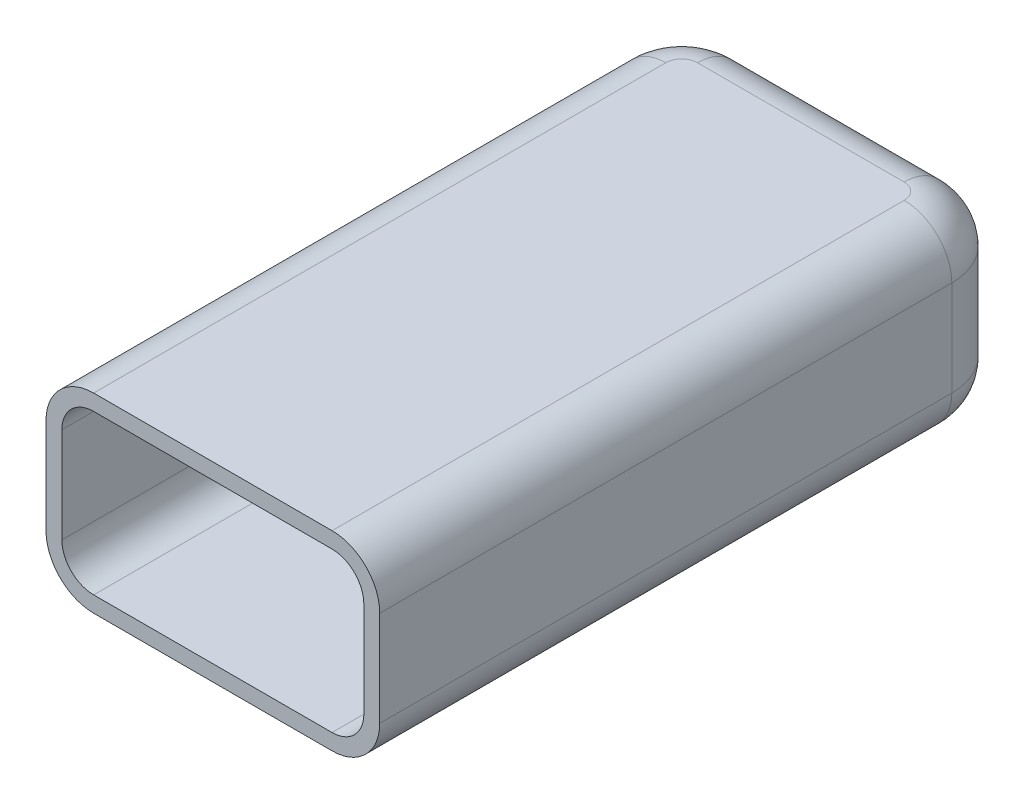
ISO-10303-21;
HEADER;
FILE_DESCRIPTION(('STEP AP214'),'2;1');
FILE_NAME('part.step','',(''),(''),'','','');
FILE_SCHEMA(('AUTOMOTIVE_DESIGN { 1 0 10303 214 1 1 1 1 }'));
ENDSEC;
DATA;
#1=APPLICATION_CONTEXT('core data for automotive mechanical design processes');
#2=APPLICATION_PROTOCOL_DEFINITION('international standard','automotive_design',2000,#1);
#3=PRODUCT_CONTEXT('',#1,'mechanical');
#4=PRODUCT('Part','Part','',(#3));
#5=PRODUCT_RELATED_PRODUCT_CATEGORY('part','',(#4));
#6=PRODUCT_DEFINITION_FORMATION('','',#4);
#7=PRODUCT_DEFINITION_CONTEXT('part definition',#1,'design');
#8=PRODUCT_DEFINITION('design','',#6,#7);
#9=PRODUCT_DEFINITION_SHAPE('','',#8);
#10=(LENGTH_UNIT() NAMED_UNIT(*) SI_UNIT(.MILLI.,.METRE.));
#11=(NAMED_UNIT(*) PLANE_ANGLE_UNIT() SI_UNIT($,.RADIAN.));
#12=(NAMED_UNIT(*) SI_UNIT($,.STERADIAN.) SOLID_ANGLE_UNIT());
#13=UNCERTAINTY_MEASURE_WITH_UNIT(LENGTH_MEASURE(1.E-05),#10,'distance_accuracy_value','');
#14=(GEOMETRIC_REPRESENTATION_CONTEXT(3) GLOBAL_UNCERTAINTY_ASSIGNED_CONTEXT((#13)) GLOBAL_UNIT_ASSIGNED_CONTEXT((#10,
#11,#12)) REPRESENTATION_CONTEXT('',''));
#15=CARTESIAN_POINT('',(0.,0.,0.));
#16=DIRECTION('',(0.,0.,1.));
#17=DIRECTION('',(1.,0.,0.));
#18=AXIS2_PLACEMENT_3D('',#15,#16,#17);
#19=CARTESIAN_POINT('',(0.,12.,0.));
#20=DIRECTION('',(1.,0.,0.));
#21=DIRECTION('',(0.,0.,-1.));
#22=AXIS2_PLACEMENT_3D('',#19,#20,#21);
#23=PLANE('',#22);
#24=DIRECTION('',(0.,-1.,0.));
#25=VECTOR('',#24,1.);
#26=CARTESIAN_POINT('',(0.,12.,0.));
#27=LINE('',#26,#25);
#28=CARTESIAN_POINT('',(0.,9.,0.));
#29=VERTEX_POINT('',#28);
#30=CARTESIAN_POINT('',(0.,3.,0.));
#31=VERTEX_POINT('',#30);
#32=EDGE_CURVE('E326',#29,#31,#27,.T.);
#33=ORIENTED_EDGE('',*,*,#32,.F.);
#34=DIRECTION('',(0.,0.,1.));
#35=VECTOR('',#34,1.);
#36=CARTESIAN_POINT('',(0.,9.,0.));
#37=LINE('',#36,#35);
#38=CARTESIAN_POINT('',(0.,9.,-36.));
#39=VERTEX_POINT('',#38);
#40=EDGE_CURVE('E199',#29,#39,#37,.F.);
#41=ORIENTED_EDGE('',*,*,#40,.T.);
#42=DIRECTION('',(0.,-1.,0.));
#43=VECTOR('',#42,1.);
#44=CARTESIAN_POINT('',(0.,12.,-36.));
#45=LINE('',#44,#43);
#46=CARTESIAN_POINT('',(0.,3.,-36.));
#47=VERTEX_POINT('',#46);
#48=EDGE_CURVE('E328',#39,#47,#45,.T.);
#49=ORIENTED_EDGE('',*,*,#48,.T.);
#50=DIRECTION('',(0.,0.,1.));
#51=VECTOR('',#50,1.);
#52=CARTESIAN_POINT('',(0.,3.,0.));
#53=LINE('',#52,#51);
#54=EDGE_CURVE('E219',#47,#31,#53,.T.);
#55=ORIENTED_EDGE('',*,*,#54,.T.);
#56=EDGE_LOOP('',(#33,#41,#49,#55));
#57=FACE_BOUND('',#56,.T.);
#58=ADVANCED_FACE('F36',(#57),#23,.F.);
#59=CARTESIAN_POINT('',(0.,12.,0.));
#60=DIRECTION('',(0.,0.,-1.));
#61=DIRECTION('',(-1.,0.,0.));
#62=AXIS2_PLACEMENT_3D('',#59,#60,#61);
#63=PLANE('',#62);
#64=DIRECTION('',(-1.,0.,0.));
#65=VECTOR('',#64,1.);
#66=CARTESIAN_POINT('',(20.,11.,0.));
#67=LINE('',#66,#65);
#68=CARTESIAN_POINT('',(18.,11.,0.));
#69=VERTEX_POINT('',#68);
#70=CARTESIAN_POINT('',(3.,11.,0.));
#71=VERTEX_POINT('',#70);
#72=EDGE_CURVE('E288',#69,#71,#67,.T.);
#73=ORIENTED_EDGE('',*,*,#72,.F.);
#74=CARTESIAN_POINT('',(18.,9.,0.));
#75=DIRECTION('',(0.,0.,-1.));
#76=DIRECTION('',(-1.,0.,0.));
#77=AXIS2_PLACEMENT_3D('',#74,#75,#76);
#78=CIRCLE('',#77,2.);
#79=CARTESIAN_POINT('',(20.,9.,0.));
#80=VERTEX_POINT('',#79);
#81=EDGE_CURVE('E285',#69,#80,#78,.T.);
#82=ORIENTED_EDGE('',*,*,#81,.T.);
#83=DIRECTION('',(0.,1.,0.));
#84=VECTOR('',#83,1.);
#85=CARTESIAN_POINT('',(20.,1.,0.));
#86=LINE('',#85,#84);
#87=CARTESIAN_POINT('',(20.,3.,0.));
#88=VERTEX_POINT('',#87);
#89=EDGE_CURVE('E245',#88,#80,#86,.T.);
#90=ORIENTED_EDGE('',*,*,#89,.F.);
#91=CARTESIAN_POINT('',(18.,3.,0.));
#92=DIRECTION('',(0.,0.,-1.));
#93=DIRECTION('',(-1.,0.,0.));
#94=AXIS2_PLACEMENT_3D('',#91,#92,#93);
#95=CIRCLE('',#94,2.);
#96=CARTESIAN_POINT('',(18.,1.,0.));
#97=VERTEX_POINT('',#96);
#98=EDGE_CURVE('E283',#88,#97,#95,.T.);
#99=ORIENTED_EDGE('',*,*,#98,.T.);
#100=DIRECTION('',(1.,0.,0.));
#101=VECTOR('',#100,1.);
#102=CARTESIAN_POINT('',(1.,1.,0.));
#103=LINE('',#102,#101);
#104=CARTESIAN_POINT('',(3.,1.,0.));
#105=VERTEX_POINT('',#104);
#106=EDGE_CURVE('E319',#105,#97,#103,.T.);
#107=ORIENTED_EDGE('',*,*,#106,.F.);
#108=CARTESIAN_POINT('',(3.,3.,0.));
#109=DIRECTION('',(0.,0.,-1.));
#110=DIRECTION('',(-1.,0.,0.));
#111=AXIS2_PLACEMENT_3D('',#108,#109,#110);
#112=CIRCLE('',#111,2.);
#113=CARTESIAN_POINT('',(1.,3.,0.));
#114=VERTEX_POINT('',#113);
#115=EDGE_CURVE('E11',#105,#114,#112,.T.);
#116=ORIENTED_EDGE('',*,*,#115,.T.);
#117=DIRECTION('',(0.,-1.,0.));
#118=VECTOR('',#117,1.);
#119=CARTESIAN_POINT('',(1.,11.,0.));
#120=LINE('',#119,#118);
#121=CARTESIAN_POINT('',(1.,9.,0.));
#122=VERTEX_POINT('',#121);
#123=EDGE_CURVE('E289',#122,#114,#120,.T.);
#124=ORIENTED_EDGE('',*,*,#123,.F.);
#125=CARTESIAN_POINT('',(3.,9.,0.));
#126=DIRECTION('',(0.,0.,-1.));
#127=DIRECTION('',(-1.,0.,0.));
#128=AXIS2_PLACEMENT_3D('',#125,#126,#127);
#129=CIRCLE('',#128,2.);
#130=EDGE_CURVE('E44',#122,#71,#129,.T.);
#131=ORIENTED_EDGE('',*,*,#130,.T.);
#132=EDGE_LOOP('',(#73,#82,#90,#99,#107,#116,#124,#131));
#133=FACE_BOUND('',#132,.T.);
#134=DIRECTION('',(0.,-1.,0.));
#135=VECTOR('',#134,1.);
#136=CARTESIAN_POINT('',(21.,12.,0.));
#137=LINE('',#136,#135);
#138=CARTESIAN_POINT('',(21.,9.,0.));
#139=VERTEX_POINT('',#138);
#140=CARTESIAN_POINT('',(21.,3.,0.));
#141=VERTEX_POINT('',#140);
#142=EDGE_CURVE('E194',#139,#141,#137,.T.);
#143=ORIENTED_EDGE('',*,*,#142,.F.);
#144=CARTESIAN_POINT('',(18.,9.,0.));
#145=DIRECTION('',(0.,0.,-1.));
#146=DIRECTION('',(-1.,0.,0.));
#147=AXIS2_PLACEMENT_3D('',#144,#145,#146);
#148=CIRCLE('',#147,3.);
#149=CARTESIAN_POINT('',(18.,12.,0.));
#150=VERTEX_POINT('',#149);
#151=EDGE_CURVE('E193',#139,#150,#148,.F.);
#152=ORIENTED_EDGE('',*,*,#151,.T.);
#153=DIRECTION('',(1.,0.,0.));
#154=VECTOR('',#153,1.);
#155=CARTESIAN_POINT('',(0.,12.,0.));
#156=LINE('',#155,#154);
#157=CARTESIAN_POINT('',(3.,12.,0.));
#158=VERTEX_POINT('',#157);
#159=EDGE_CURVE('E176',#158,#150,#156,.T.);
#160=ORIENTED_EDGE('',*,*,#159,.F.);
#161=CARTESIAN_POINT('',(3.,9.,0.));
#162=DIRECTION('',(0.,0.,-1.));
#163=DIRECTION('',(-1.,0.,0.));
#164=AXIS2_PLACEMENT_3D('',#161,#162,#163);
#165=CIRCLE('',#164,3.);
#166=EDGE_CURVE('E190',#158,#29,#165,.F.);
#167=ORIENTED_EDGE('',*,*,#166,.T.);
#168=ORIENTED_EDGE('',*,*,#32,.T.);
#169=CARTESIAN_POINT('',(3.,3.,0.));
#170=DIRECTION('',(0.,0.,-1.));
#171=DIRECTION('',(-1.,0.,0.));
#172=AXIS2_PLACEMENT_3D('',#169,#170,#171);
#173=CIRCLE('',#172,3.);
#174=CARTESIAN_POINT('',(3.,0.,0.));
#175=VERTEX_POINT('',#174);
#176=EDGE_CURVE('E200',#31,#175,#173,.F.);
#177=ORIENTED_EDGE('',*,*,#176,.T.);
#178=DIRECTION('',(1.,0.,0.));
#179=VECTOR('',#178,1.);
#180=CARTESIAN_POINT('',(0.,0.,0.));
#181=LINE('',#180,#179);
#182=CARTESIAN_POINT('',(18.,0.,0.));
#183=VERTEX_POINT('',#182);
#184=EDGE_CURVE('E195',#175,#183,#181,.T.);
#185=ORIENTED_EDGE('',*,*,#184,.T.);
#186=CARTESIAN_POINT('',(18.,3.,0.));
#187=DIRECTION('',(0.,0.,-1.));
#188=DIRECTION('',(-1.,0.,0.));
#189=AXIS2_PLACEMENT_3D('',#186,#187,#188);
#190=CIRCLE('',#189,3.);
#191=EDGE_CURVE('E204',#183,#141,#190,.F.);
#192=ORIENTED_EDGE('',*,*,#191,.T.);
#193=EDGE_LOOP('',(#143,#152,#160,#167,#168,#177,#185,#192));
#194=FACE_BOUND('',#193,.T.);
#195=ADVANCED_FACE('F188',(#133,#194),#63,.F.);
#196=CARTESIAN_POINT('',(21.,12.,0.));
#197=DIRECTION('',(-1.,0.,0.));
#198=DIRECTION('',(0.,0.,1.));
#199=AXIS2_PLACEMENT_3D('',#196,#197,#198);
#200=PLANE('',#199);
#201=DIRECTION('',(0.,-1.,0.));
#202=VECTOR('',#201,1.);
#203=CARTESIAN_POINT('',(21.,12.,-36.));
#204=LINE('',#203,#202);
#205=CARTESIAN_POINT('',(21.,3.,-36.));
#206=VERTEX_POINT('',#205);
#207=CARTESIAN_POINT('',(21.,9.,-36.));
#208=VERTEX_POINT('',#207);
#209=EDGE_CURVE('E184',#206,#208,#204,.F.);
#210=ORIENTED_EDGE('',*,*,#209,.T.);
#211=DIRECTION('',(0.,0.,-1.));
#212=VECTOR('',#211,1.);
#213=CARTESIAN_POINT('',(21.,9.,0.));
#214=LINE('',#213,#212);
#215=EDGE_CURVE('E348',#208,#139,#214,.F.);
#216=ORIENTED_EDGE('',*,*,#215,.T.);
#217=ORIENTED_EDGE('',*,*,#142,.T.);
#218=DIRECTION('',(0.,0.,-1.));
#219=VECTOR('',#218,1.);
#220=CARTESIAN_POINT('',(21.,3.,-36.));
#221=LINE('',#220,#219);
#222=EDGE_CURVE('E346',#141,#206,#221,.T.);
#223=ORIENTED_EDGE('',*,*,#222,.T.);
#224=EDGE_LOOP('',(#210,#216,#217,#223));
#225=FACE_BOUND('',#224,.T.);
#226=ADVANCED_FACE('F355',(#225),#200,.F.);
#227=CARTESIAN_POINT('',(0.,12.,-40.));
#228=DIRECTION('',(0.,0.,1.));
#229=DIRECTION('',(1.,0.,0.));
#230=AXIS2_PLACEMENT_3D('',#227,#228,#229);
#231=PLANE('',#230);
#232=DIRECTION('',(0.,-1.,0.));
#233=VECTOR('',#232,1.);
#234=CARTESIAN_POINT('',(4.,12.,-40.));
#235=LINE('',#234,#233);
#236=CARTESIAN_POINT('',(4.,3.,-40.));
#237=VERTEX_POINT('',#236);
#238=CARTESIAN_POINT('',(4.,9.,-40.));
#239=VERTEX_POINT('',#238);
#240=EDGE_CURVE('E334',#237,#239,#235,.F.);
#241=ORIENTED_EDGE('',*,*,#240,.T.);
#242=DIRECTION('',(-1.,0.,0.));
#243=VECTOR('',#242,1.);
#244=CARTESIAN_POINT('',(0.,9.,-40.));
#245=LINE('',#244,#243);
#246=CARTESIAN_POINT('',(17.,9.,-40.));
#247=VERTEX_POINT('',#246);
#248=EDGE_CURVE('E213',#239,#247,#245,.F.);
#249=ORIENTED_EDGE('',*,*,#248,.T.);
#250=DIRECTION('',(0.,-1.,0.));
#251=VECTOR('',#250,1.);
#252=CARTESIAN_POINT('',(17.,12.,-40.));
#253=LINE('',#252,#251);
#254=CARTESIAN_POINT('',(17.,3.,-40.));
#255=VERTEX_POINT('',#254);
#256=EDGE_CURVE('E331',#247,#255,#253,.T.);
#257=ORIENTED_EDGE('',*,*,#256,.T.);
#258=DIRECTION('',(-1.,0.,0.));
#259=VECTOR('',#258,1.);
#260=CARTESIAN_POINT('',(4.,3.,-40.));
#261=LINE('',#260,#259);
#262=EDGE_CURVE('E211',#255,#237,#261,.T.);
#263=ORIENTED_EDGE('',*,*,#262,.T.);
#264=EDGE_LOOP('',(#241,#249,#257,#263));
#265=FACE_BOUND('',#264,.T.);
#266=ADVANCED_FACE('F371',(#265),#231,.F.);
#267=CARTESIAN_POINT('',(0.,12.,0.));
#268=DIRECTION('',(0.,-1.,0.));
#269=DIRECTION('',(0.,0.,-1.));
#270=AXIS2_PLACEMENT_3D('',#267,#268,#269);
#271=PLANE('',#270);
#272=ORIENTED_EDGE('',*,*,#159,.T.);
#273=DIRECTION('',(0.,0.,-1.));
#274=VECTOR('',#273,1.);
#275=CARTESIAN_POINT('',(18.,12.,0.));
#276=LINE('',#275,#274);
#277=CARTESIAN_POINT('',(18.,12.,-36.));
#278=VERTEX_POINT('',#277);
#279=EDGE_CURVE('E344',#150,#278,#276,.T.);
#280=ORIENTED_EDGE('',*,*,#279,.T.);
#281=CARTESIAN_POINT('',(17.,12.,-36.));
#282=DIRECTION('',(0.,-1.,0.));
#283=DIRECTION('',(0.,0.,-1.));
#284=AXIS2_PLACEMENT_3D('',#281,#282,#283);
#285=CIRCLE('',#284,1.);
#286=CARTESIAN_POINT('',(17.,12.,-37.));
#287=VERTEX_POINT('',#286);
#288=EDGE_CURVE('E342',#278,#287,#285,.F.);
#289=ORIENTED_EDGE('',*,*,#288,.T.);
#290=DIRECTION('',(-1.,0.,0.));
#291=VECTOR('',#290,1.);
#292=CARTESIAN_POINT('',(0.,12.,-37.));
#293=LINE('',#292,#291);
#294=CARTESIAN_POINT('',(4.,12.,-37.));
#295=VERTEX_POINT('',#294);
#296=EDGE_CURVE('E340',#287,#295,#293,.T.);
#297=ORIENTED_EDGE('',*,*,#296,.T.);
#298=CARTESIAN_POINT('',(4.,12.,-36.));
#299=DIRECTION('',(0.,-1.,0.));
#300=DIRECTION('',(0.,0.,-1.));
#301=AXIS2_PLACEMENT_3D('',#298,#299,#300);
#302=CIRCLE('',#301,1.);
#303=CARTESIAN_POINT('',(3.,12.,-36.));
#304=VERTEX_POINT('',#303);
#305=EDGE_CURVE('E179',#295,#304,#302,.F.);
#306=ORIENTED_EDGE('',*,*,#305,.T.);
#307=DIRECTION('',(0.,0.,1.));
#308=VECTOR('',#307,1.);
#309=CARTESIAN_POINT('',(3.,12.,0.));
#310=LINE('',#309,#308);
#311=EDGE_CURVE('E172',#304,#158,#310,.T.);
#312=ORIENTED_EDGE('',*,*,#311,.T.);
#313=EDGE_LOOP('',(#272,#280,#289,#297,#306,#312));
#314=FACE_BOUND('',#313,.T.);
#315=ADVANCED_FACE('F174',(#314),#271,.F.);
#316=CARTESIAN_POINT('',(0.,0.,0.));
#317=DIRECTION('',(0.,-1.,0.));
#318=DIRECTION('',(0.,0.,-1.));
#319=AXIS2_PLACEMENT_3D('',#316,#317,#318);
#320=PLANE('',#319);
#321=ORIENTED_EDGE('',*,*,#184,.F.);
#322=DIRECTION('',(0.,0.,1.));
#323=VECTOR('',#322,1.);
#324=CARTESIAN_POINT('',(3.,0.,-36.));
#325=LINE('',#324,#323);
#326=CARTESIAN_POINT('',(3.,0.,-36.));
#327=VERTEX_POINT('',#326);
#328=EDGE_CURVE('E231',#175,#327,#325,.F.);
#329=ORIENTED_EDGE('',*,*,#328,.T.);
#330=CARTESIAN_POINT('',(4.,0.,-36.));
#331=DIRECTION('',(0.,-1.,0.));
#332=DIRECTION('',(0.,0.,-1.));
#333=AXIS2_PLACEMENT_3D('',#330,#331,#332);
#334=CIRCLE('',#333,1.);
#335=CARTESIAN_POINT('',(4.,0.,-37.));
#336=VERTEX_POINT('',#335);
#337=EDGE_CURVE('E229',#327,#336,#334,.T.);
#338=ORIENTED_EDGE('',*,*,#337,.T.);
#339=DIRECTION('',(-1.,0.,0.));
#340=VECTOR('',#339,1.);
#341=CARTESIAN_POINT('',(17.,0.,-37.));
#342=LINE('',#341,#340);
#343=CARTESIAN_POINT('',(17.,0.,-37.));
#344=VERTEX_POINT('',#343);
#345=EDGE_CURVE('E227',#336,#344,#342,.F.);
#346=ORIENTED_EDGE('',*,*,#345,.T.);
#347=CARTESIAN_POINT('',(17.,0.,-36.));
#348=DIRECTION('',(0.,-1.,0.));
#349=DIRECTION('',(0.,0.,-1.));
#350=AXIS2_PLACEMENT_3D('',#347,#348,#349);
#351=CIRCLE('',#350,1.);
#352=CARTESIAN_POINT('',(18.,0.,-36.));
#353=VERTEX_POINT('',#352);
#354=EDGE_CURVE('E225',#344,#353,#351,.T.);
#355=ORIENTED_EDGE('',*,*,#354,.T.);
#356=DIRECTION('',(0.,0.,-1.));
#357=VECTOR('',#356,1.);
#358=CARTESIAN_POINT('',(18.,0.,0.));
#359=LINE('',#358,#357);
#360=EDGE_CURVE('E223',#353,#183,#359,.F.);
#361=ORIENTED_EDGE('',*,*,#360,.T.);
#362=EDGE_LOOP('',(#321,#329,#338,#346,#355,#361));
#363=FACE_BOUND('',#362,.T.);
#364=ADVANCED_FACE('F403',(#363),#320,.T.);
#365=CARTESIAN_POINT('',(20.,1.,-35.));
#366=DIRECTION('',(1.,0.,0.));
#367=DIRECTION('',(0.,0.,-1.));
#368=AXIS2_PLACEMENT_3D('',#365,#366,#367);
#369=PLANE('',#368);
#370=DIRECTION('',(0.,1.,0.));
#371=VECTOR('',#370,1.);
#372=CARTESIAN_POINT('',(20.,1.,-35.));
#373=LINE('',#372,#371);
#374=CARTESIAN_POINT('',(20.,3.,-35.));
#375=VERTEX_POINT('',#374);
#376=CARTESIAN_POINT('',(20.,9.,-35.));
#377=VERTEX_POINT('',#376);
#378=EDGE_CURVE('E312',#375,#377,#373,.T.);
#379=ORIENTED_EDGE('',*,*,#378,.F.);
#380=DIRECTION('',(0.,0.,1.));
#381=VECTOR('',#380,1.);
#382=CARTESIAN_POINT('',(20.,3.,0.));
#383=LINE('',#382,#381);
#384=EDGE_CURVE('E258',#375,#88,#383,.T.);
#385=ORIENTED_EDGE('',*,*,#384,.T.);
#386=ORIENTED_EDGE('',*,*,#89,.T.);
#387=DIRECTION('',(0.,0.,1.));
#388=VECTOR('',#387,1.);
#389=CARTESIAN_POINT('',(20.,9.,-35.));
#390=LINE('',#389,#388);
#391=EDGE_CURVE('E233',#80,#377,#390,.F.);
#392=ORIENTED_EDGE('',*,*,#391,.T.);
#393=EDGE_LOOP('',(#379,#385,#386,#392));
#394=FACE_BOUND('',#393,.T.);
#395=ADVANCED_FACE('F469',(#394),#369,.F.);
#396=CARTESIAN_POINT('',(1.,1.,-35.));
#397=DIRECTION('',(0.,-1.,0.));
#398=DIRECTION('',(0.,0.,-1.));
#399=AXIS2_PLACEMENT_3D('',#396,#397,#398);
#400=PLANE('',#399);
#401=ORIENTED_EDGE('',*,*,#106,.T.);
#402=DIRECTION('',(0.,0.,1.));
#403=VECTOR('',#402,1.);
#404=CARTESIAN_POINT('',(18.,1.,-35.));
#405=LINE('',#404,#403);
#406=CARTESIAN_POINT('',(18.,1.,-35.));
#407=VERTEX_POINT('',#406);
#408=EDGE_CURVE('E264',#97,#407,#405,.F.);
#409=ORIENTED_EDGE('',*,*,#408,.T.);
#410=DIRECTION('',(1.,0.,0.));
#411=VECTOR('',#410,1.);
#412=CARTESIAN_POINT('',(1.,1.,-35.));
#413=LINE('',#412,#411);
#414=CARTESIAN_POINT('',(3.,1.,-35.));
#415=VERTEX_POINT('',#414);
#416=EDGE_CURVE('E309',#415,#407,#413,.T.);
#417=ORIENTED_EDGE('',*,*,#416,.F.);
#418=DIRECTION('',(0.,0.,1.));
#419=VECTOR('',#418,1.);
#420=CARTESIAN_POINT('',(3.,1.,0.));
#421=LINE('',#420,#419);
#422=EDGE_CURVE('E261',#415,#105,#421,.T.);
#423=ORIENTED_EDGE('',*,*,#422,.T.);
#424=EDGE_LOOP('',(#401,#409,#417,#423));
#425=FACE_BOUND('',#424,.T.);
#426=ADVANCED_FACE('F462',(#425),#400,.F.);
#427=CARTESIAN_POINT('',(1.,11.,-35.));
#428=DIRECTION('',(-1.,0.,0.));
#429=DIRECTION('',(0.,0.,1.));
#430=AXIS2_PLACEMENT_3D('',#427,#428,#429);
#431=PLANE('',#430);
#432=DIRECTION('',(0.,-1.,0.));
#433=VECTOR('',#432,1.);
#434=CARTESIAN_POINT('',(1.,11.,-35.));
#435=LINE('',#434,#433);
#436=CARTESIAN_POINT('',(1.,9.,-35.));
#437=VERTEX_POINT('',#436);
#438=CARTESIAN_POINT('',(1.,3.,-35.));
#439=VERTEX_POINT('',#438);
#440=EDGE_CURVE('E303',#437,#439,#435,.T.);
#441=ORIENTED_EDGE('',*,*,#440,.F.);
#442=DIRECTION('',(0.,0.,1.));
#443=VECTOR('',#442,1.);
#444=CARTESIAN_POINT('',(1.,9.,0.));
#445=LINE('',#444,#443);
#446=EDGE_CURVE('E281',#437,#122,#445,.T.);
#447=ORIENTED_EDGE('',*,*,#446,.T.);
#448=ORIENTED_EDGE('',*,*,#123,.T.);
#449=DIRECTION('',(0.,0.,1.));
#450=VECTOR('',#449,1.);
#451=CARTESIAN_POINT('',(1.,3.,-35.));
#452=LINE('',#451,#450);
#453=EDGE_CURVE('E279',#114,#439,#452,.F.);
#454=ORIENTED_EDGE('',*,*,#453,.T.);
#455=EDGE_LOOP('',(#441,#447,#448,#454));
#456=FACE_BOUND('',#455,.T.);
#457=ADVANCED_FACE('F307',(#456),#431,.F.);
#458=CARTESIAN_POINT('',(20.,11.,-35.));
#459=DIRECTION('',(0.,1.,0.));
#460=DIRECTION('',(0.,0.,1.));
#461=AXIS2_PLACEMENT_3D('',#458,#459,#460);
#462=PLANE('',#461);
#463=DIRECTION('',(-1.,0.,0.));
#464=VECTOR('',#463,1.);
#465=CARTESIAN_POINT('',(20.,11.,-35.));
#466=LINE('',#465,#464);
#467=CARTESIAN_POINT('',(18.,11.,-35.));
#468=VERTEX_POINT('',#467);
#469=CARTESIAN_POINT('',(3.,11.,-35.));
#470=VERTEX_POINT('',#469);
#471=EDGE_CURVE('E305',#468,#470,#466,.T.);
#472=ORIENTED_EDGE('',*,*,#471,.F.);
#473=DIRECTION('',(0.,0.,1.));
#474=VECTOR('',#473,1.);
#475=CARTESIAN_POINT('',(18.,11.,0.));
#476=LINE('',#475,#474);
#477=EDGE_CURVE('E276',#468,#69,#476,.T.);
#478=ORIENTED_EDGE('',*,*,#477,.T.);
#479=ORIENTED_EDGE('',*,*,#72,.T.);
#480=DIRECTION('',(0.,0.,1.));
#481=VECTOR('',#480,1.);
#482=CARTESIAN_POINT('',(3.,11.,-35.));
#483=LINE('',#482,#481);
#484=EDGE_CURVE('E274',#71,#470,#483,.F.);
#485=ORIENTED_EDGE('',*,*,#484,.T.);
#486=EDGE_LOOP('',(#472,#478,#479,#485));
#487=FACE_BOUND('',#486,.T.);
#488=ADVANCED_FACE('F292',(#487),#462,.F.);
#489=CARTESIAN_POINT('',(0.,0.,-35.));
#490=DIRECTION('',(0.,0.,1.));
#491=DIRECTION('',(1.,0.,0.));
#492=AXIS2_PLACEMENT_3D('',#489,#490,#491);
#493=PLANE('',#492);
#494=ORIENTED_EDGE('',*,*,#416,.T.);
#495=CARTESIAN_POINT('',(18.,3.,-35.));
#496=DIRECTION('',(0.,0.,1.));
#497=DIRECTION('',(1.,0.,0.));
#498=AXIS2_PLACEMENT_3D('',#495,#496,#497);
#499=CIRCLE('',#498,2.);
#500=EDGE_CURVE('E272',#407,#375,#499,.T.);
#501=ORIENTED_EDGE('',*,*,#500,.T.);
#502=ORIENTED_EDGE('',*,*,#378,.T.);
#503=CARTESIAN_POINT('',(18.,9.,-35.));
#504=DIRECTION('',(0.,0.,1.));
#505=DIRECTION('',(1.,0.,0.));
#506=AXIS2_PLACEMENT_3D('',#503,#504,#505);
#507=CIRCLE('',#506,2.);
#508=EDGE_CURVE('E270',#377,#468,#507,.T.);
#509=ORIENTED_EDGE('',*,*,#508,.T.);
#510=ORIENTED_EDGE('',*,*,#471,.T.);
#511=CARTESIAN_POINT('',(3.,9.,-35.));
#512=DIRECTION('',(0.,0.,1.));
#513=DIRECTION('',(1.,0.,0.));
#514=AXIS2_PLACEMENT_3D('',#511,#512,#513);
#515=CIRCLE('',#514,2.);
#516=EDGE_CURVE('E268',#470,#437,#515,.T.);
#517=ORIENTED_EDGE('',*,*,#516,.T.);
#518=ORIENTED_EDGE('',*,*,#440,.T.);
#519=CARTESIAN_POINT('',(3.,3.,-35.));
#520=DIRECTION('',(0.,0.,1.));
#521=DIRECTION('',(1.,0.,0.));
#522=AXIS2_PLACEMENT_3D('',#519,#520,#521);
#523=CIRCLE('',#522,2.);
#524=EDGE_CURVE('E266',#439,#415,#523,.T.);
#525=ORIENTED_EDGE('',*,*,#524,.T.);
#526=EDGE_LOOP('',(#494,#501,#502,#509,#510,#517,#518,#525));
#527=FACE_BOUND('',#526,.T.);
#528=ADVANCED_FACE('F302',(#527),#493,.T.);
#529=CARTESIAN_POINT('',(4.,12.,-36.));
#530=DIRECTION('',(0.,-1.,0.));
#531=DIRECTION('',(0.,0.,-1.));
#532=AXIS2_PLACEMENT_3D('',#529,#530,#531);
#533=CYLINDRICAL_SURFACE('',#532,4.);
#534=ORIENTED_EDGE('',*,*,#48,.F.);
#535=CARTESIAN_POINT('',(4.,9.,-36.));
#536=DIRECTION('',(0.,-1.,0.));
#537=DIRECTION('',(0.,0.,-1.));
#538=AXIS2_PLACEMENT_3D('',#535,#536,#537);
#539=CIRCLE('',#538,4.);
#540=EDGE_CURVE('E217',#39,#239,#539,.T.);
#541=ORIENTED_EDGE('',*,*,#540,.T.);
#542=ORIENTED_EDGE('',*,*,#240,.F.);
#543=CARTESIAN_POINT('',(4.,3.,-36.));
#544=DIRECTION('',(0.,-1.,0.));
#545=DIRECTION('',(0.,0.,-1.));
#546=AXIS2_PLACEMENT_3D('',#543,#544,#545);
#547=CIRCLE('',#546,4.);
#548=EDGE_CURVE('E215',#237,#47,#547,.F.);
#549=ORIENTED_EDGE('',*,*,#548,.T.);
#550=EDGE_LOOP('',(#534,#541,#542,#549));
#551=FACE_BOUND('',#550,.T.);
#552=ADVANCED_FACE('F390',(#551),#533,.T.);
#553=CARTESIAN_POINT('',(17.,12.,-36.));
#554=DIRECTION('',(0.,-1.,0.));
#555=DIRECTION('',(0.,0.,-1.));
#556=AXIS2_PLACEMENT_3D('',#553,#554,#555);
#557=CYLINDRICAL_SURFACE('',#556,4.);
#558=ORIENTED_EDGE('',*,*,#256,.F.);
#559=CARTESIAN_POINT('',(17.,9.,-36.));
#560=DIRECTION('',(0.,-1.,0.));
#561=DIRECTION('',(0.,0.,-1.));
#562=AXIS2_PLACEMENT_3D('',#559,#560,#561);
#563=CIRCLE('',#562,4.);
#564=EDGE_CURVE('E209',#247,#208,#563,.T.);
#565=ORIENTED_EDGE('',*,*,#564,.T.);
#566=ORIENTED_EDGE('',*,*,#209,.F.);
#567=CARTESIAN_POINT('',(17.,3.,-36.));
#568=DIRECTION('',(0.,-1.,0.));
#569=DIRECTION('',(0.,0.,-1.));
#570=AXIS2_PLACEMENT_3D('',#567,#568,#569);
#571=CIRCLE('',#570,4.);
#572=EDGE_CURVE('E202',#206,#255,#571,.F.);
#573=ORIENTED_EDGE('',*,*,#572,.T.);
#574=EDGE_LOOP('',(#558,#565,#566,#573));
#575=FACE_BOUND('',#574,.T.);
#576=ADVANCED_FACE('F368',(#575),#557,.T.);
#577=CARTESIAN_POINT('',(3.,9.,0.));
#578=DIRECTION('',(0.,0.,1.));
#579=DIRECTION('',(1.,0.,0.));
#580=AXIS2_PLACEMENT_3D('',#577,#578,#579);
#581=CYLINDRICAL_SURFACE('',#580,3.);
#582=ORIENTED_EDGE('',*,*,#166,.F.);
#583=ORIENTED_EDGE('',*,*,#311,.F.);
#584=CARTESIAN_POINT('',(3.,9.,-36.));
#585=DIRECTION('',(0.,0.,-1.));
#586=DIRECTION('',(-1.,0.,0.));
#587=AXIS2_PLACEMENT_3D('',#584,#585,#586);
#588=CIRCLE('',#587,3.);
#589=EDGE_CURVE('E243',#39,#304,#588,.T.);
#590=ORIENTED_EDGE('',*,*,#589,.F.);
#591=ORIENTED_EDGE('',*,*,#40,.F.);
#592=EDGE_LOOP('',(#582,#583,#590,#591));
#593=FACE_BOUND('',#592,.T.);
#594=ADVANCED_FACE('F198',(#593),#581,.T.);
#595=CARTESIAN_POINT('',(4.,9.,-36.));
#596=DIRECTION('',(0.,-1.,0.));
#597=DIRECTION('',(0.,0.,-1.));
#598=AXIS2_PLACEMENT_3D('',#595,#596,#597);
#599=DEGENERATE_TOROIDAL_SURFACE('',#598,1.,3.,.T.);
#600=ORIENTED_EDGE('',*,*,#589,.T.);
#601=ORIENTED_EDGE('',*,*,#305,.F.);
#602=CARTESIAN_POINT('',(4.,9.,-37.));
#603=DIRECTION('',(1.,0.,0.));
#604=DIRECTION('',(0.,0.,-1.));
#605=AXIS2_PLACEMENT_3D('',#602,#603,#604);
#606=CIRCLE('',#605,3.);
#607=EDGE_CURVE('E240',#239,#295,#606,.T.);
#608=ORIENTED_EDGE('',*,*,#607,.F.);
#609=ORIENTED_EDGE('',*,*,#540,.F.);
#610=EDGE_LOOP('',(#600,#601,#608,#609));
#611=FACE_BOUND('',#610,.T.);
#612=ADVANCED_FACE('F386',(#611),#599,.T.);
#613=CARTESIAN_POINT('',(0.,9.,-37.));
#614=DIRECTION('',(-1.,0.,0.));
#615=DIRECTION('',(0.,0.,1.));
#616=AXIS2_PLACEMENT_3D('',#613,#614,#615);
#617=CYLINDRICAL_SURFACE('',#616,3.);
#618=ORIENTED_EDGE('',*,*,#607,.T.);
#619=ORIENTED_EDGE('',*,*,#296,.F.);
#620=CARTESIAN_POINT('',(17.,9.,-37.));
#621=DIRECTION('',(1.,0.,0.));
#622=DIRECTION('',(0.,0.,-1.));
#623=AXIS2_PLACEMENT_3D('',#620,#621,#622);
#624=CIRCLE('',#623,3.);
#625=EDGE_CURVE('E236',#247,#287,#624,.T.);
#626=ORIENTED_EDGE('',*,*,#625,.F.);
#627=ORIENTED_EDGE('',*,*,#248,.F.);
#628=EDGE_LOOP('',(#618,#619,#626,#627));
#629=FACE_BOUND('',#628,.T.);
#630=ADVANCED_FACE('F376',(#629),#617,.T.);
#631=CARTESIAN_POINT('',(17.,9.,-36.));
#632=DIRECTION('',(0.,-1.,0.));
#633=DIRECTION('',(0.,0.,-1.));
#634=AXIS2_PLACEMENT_3D('',#631,#632,#633);
#635=DEGENERATE_TOROIDAL_SURFACE('',#634,1.,3.,.T.);
#636=ORIENTED_EDGE('',*,*,#625,.T.);
#637=ORIENTED_EDGE('',*,*,#288,.F.);
#638=CARTESIAN_POINT('',(18.,9.,-36.));
#639=DIRECTION('',(0.,0.,1.));
#640=DIRECTION('',(1.,0.,0.));
#641=AXIS2_PLACEMENT_3D('',#638,#639,#640);
#642=CIRCLE('',#641,3.);
#643=EDGE_CURVE('E234',#208,#278,#642,.T.);
#644=ORIENTED_EDGE('',*,*,#643,.F.);
#645=ORIENTED_EDGE('',*,*,#564,.F.);
#646=EDGE_LOOP('',(#636,#637,#644,#645));
#647=FACE_BOUND('',#646,.T.);
#648=ADVANCED_FACE('F382',(#647),#635,.T.);
#649=CARTESIAN_POINT('',(18.,9.,0.));
#650=DIRECTION('',(0.,0.,-1.));
#651=DIRECTION('',(-1.,0.,0.));
#652=AXIS2_PLACEMENT_3D('',#649,#650,#651);
#653=CYLINDRICAL_SURFACE('',#652,3.);
#654=ORIENTED_EDGE('',*,*,#151,.F.);
#655=ORIENTED_EDGE('',*,*,#215,.F.);
#656=ORIENTED_EDGE('',*,*,#643,.T.);
#657=ORIENTED_EDGE('',*,*,#279,.F.);
#658=EDGE_LOOP('',(#654,#655,#656,#657));
#659=FACE_BOUND('',#658,.T.);
#660=ADVANCED_FACE('F384',(#659),#653,.T.);
#661=CARTESIAN_POINT('',(18.,3.,0.));
#662=DIRECTION('',(0.,0.,1.));
#663=DIRECTION('',(1.,0.,0.));
#664=AXIS2_PLACEMENT_3D('',#661,#662,#663);
#665=CYLINDRICAL_SURFACE('',#664,3.);
#666=ORIENTED_EDGE('',*,*,#191,.F.);
#667=ORIENTED_EDGE('',*,*,#360,.F.);
#668=CARTESIAN_POINT('',(18.,3.,-36.));
#669=DIRECTION('',(0.,0.,-1.));
#670=DIRECTION('',(-1.,0.,0.));
#671=AXIS2_PLACEMENT_3D('',#668,#669,#670);
#672=CIRCLE('',#671,3.);
#673=EDGE_CURVE('E237',#206,#353,#672,.T.);
#674=ORIENTED_EDGE('',*,*,#673,.F.);
#675=ORIENTED_EDGE('',*,*,#222,.F.);
#676=EDGE_LOOP('',(#666,#667,#674,#675));
#677=FACE_BOUND('',#676,.T.);
#678=ADVANCED_FACE('F359',(#677),#665,.T.);
#679=CARTESIAN_POINT('',(17.,3.,-36.));
#680=DIRECTION('',(0.,-1.,0.));
#681=DIRECTION('',(0.,0.,-1.));
#682=AXIS2_PLACEMENT_3D('',#679,#680,#681);
#683=DEGENERATE_TOROIDAL_SURFACE('',#682,1.,3.,.T.);
#684=ORIENTED_EDGE('',*,*,#673,.T.);
#685=ORIENTED_EDGE('',*,*,#354,.F.);
#686=CARTESIAN_POINT('',(17.,3.,-37.));
#687=DIRECTION('',(-1.,0.,0.));
#688=DIRECTION('',(0.,0.,1.));
#689=AXIS2_PLACEMENT_3D('',#686,#687,#688);
#690=CIRCLE('',#689,3.);
#691=EDGE_CURVE('E252',#255,#344,#690,.T.);
#692=ORIENTED_EDGE('',*,*,#691,.F.);
#693=ORIENTED_EDGE('',*,*,#572,.F.);
#694=EDGE_LOOP('',(#684,#685,#692,#693));
#695=FACE_BOUND('',#694,.T.);
#696=ADVANCED_FACE('F364',(#695),#683,.T.);
#697=CARTESIAN_POINT('',(0.,3.,-37.));
#698=DIRECTION('',(1.,0.,0.));
#699=DIRECTION('',(0.,0.,-1.));
#700=AXIS2_PLACEMENT_3D('',#697,#698,#699);
#701=CYLINDRICAL_SURFACE('',#700,3.);
#702=ORIENTED_EDGE('',*,*,#691,.T.);
#703=ORIENTED_EDGE('',*,*,#345,.F.);
#704=CARTESIAN_POINT('',(4.,3.,-37.));
#705=DIRECTION('',(-1.,0.,0.));
#706=DIRECTION('',(0.,0.,1.));
#707=AXIS2_PLACEMENT_3D('',#704,#705,#706);
#708=CIRCLE('',#707,3.);
#709=EDGE_CURVE('E249',#237,#336,#708,.T.);
#710=ORIENTED_EDGE('',*,*,#709,.F.);
#711=ORIENTED_EDGE('',*,*,#262,.F.);
#712=EDGE_LOOP('',(#702,#703,#710,#711));
#713=FACE_BOUND('',#712,.T.);
#714=ADVANCED_FACE('F406',(#713),#701,.T.);
#715=CARTESIAN_POINT('',(4.,3.,-36.));
#716=DIRECTION('',(0.,-1.,0.));
#717=DIRECTION('',(0.,0.,-1.));
#718=AXIS2_PLACEMENT_3D('',#715,#716,#717);
#719=DEGENERATE_TOROIDAL_SURFACE('',#718,1.,3.,.T.);
#720=ORIENTED_EDGE('',*,*,#709,.T.);
#721=ORIENTED_EDGE('',*,*,#337,.F.);
#722=CARTESIAN_POINT('',(3.,3.,-36.));
#723=DIRECTION('',(0.,0.,1.));
#724=DIRECTION('',(1.,0.,0.));
#725=AXIS2_PLACEMENT_3D('',#722,#723,#724);
#726=CIRCLE('',#725,3.);
#727=EDGE_CURVE('E246',#47,#327,#726,.T.);
#728=ORIENTED_EDGE('',*,*,#727,.F.);
#729=ORIENTED_EDGE('',*,*,#548,.F.);
#730=EDGE_LOOP('',(#720,#721,#728,#729));
#731=FACE_BOUND('',#730,.T.);
#732=ADVANCED_FACE('F398',(#731),#719,.T.);
#733=CARTESIAN_POINT('',(3.,3.,0.));
#734=DIRECTION('',(0.,0.,-1.));
#735=DIRECTION('',(-1.,0.,0.));
#736=AXIS2_PLACEMENT_3D('',#733,#734,#735);
#737=CYLINDRICAL_SURFACE('',#736,3.);
#738=ORIENTED_EDGE('',*,*,#727,.T.);
#739=ORIENTED_EDGE('',*,*,#328,.F.);
#740=ORIENTED_EDGE('',*,*,#176,.F.);
#741=ORIENTED_EDGE('',*,*,#54,.F.);
#742=EDGE_LOOP('',(#738,#739,#740,#741));
#743=FACE_BOUND('',#742,.T.);
#744=ADVANCED_FACE('F401',(#743),#737,.T.);
#745=CARTESIAN_POINT('',(18.,3.,-35.));
#746=DIRECTION('',(0.,0.,-1.));
#747=DIRECTION('',(-1.,0.,0.));
#748=AXIS2_PLACEMENT_3D('',#745,#746,#747);
#749=CYLINDRICAL_SURFACE('',#748,2.);
#750=ORIENTED_EDGE('',*,*,#500,.F.);
#751=ORIENTED_EDGE('',*,*,#408,.F.);
#752=ORIENTED_EDGE('',*,*,#98,.F.);
#753=ORIENTED_EDGE('',*,*,#384,.F.);
#754=EDGE_LOOP('',(#750,#751,#752,#753));
#755=FACE_BOUND('',#754,.T.);
#756=ADVANCED_FACE('F438',(#755),#749,.F.);
#757=CARTESIAN_POINT('',(18.,9.,-35.));
#758=DIRECTION('',(0.,0.,-1.));
#759=DIRECTION('',(-1.,0.,0.));
#760=AXIS2_PLACEMENT_3D('',#757,#758,#759);
#761=CYLINDRICAL_SURFACE('',#760,2.);
#762=ORIENTED_EDGE('',*,*,#508,.F.);
#763=ORIENTED_EDGE('',*,*,#391,.F.);
#764=ORIENTED_EDGE('',*,*,#81,.F.);
#765=ORIENTED_EDGE('',*,*,#477,.F.);
#766=EDGE_LOOP('',(#762,#763,#764,#765));
#767=FACE_BOUND('',#766,.T.);
#768=ADVANCED_FACE('F442',(#767),#761,.F.);
#769=CARTESIAN_POINT('',(3.,9.,-35.));
#770=DIRECTION('',(0.,0.,-1.));
#771=DIRECTION('',(-1.,0.,0.));
#772=AXIS2_PLACEMENT_3D('',#769,#770,#771);
#773=CYLINDRICAL_SURFACE('',#772,2.);
#774=ORIENTED_EDGE('',*,*,#516,.F.);
#775=ORIENTED_EDGE('',*,*,#484,.F.);
#776=ORIENTED_EDGE('',*,*,#130,.F.);
#777=ORIENTED_EDGE('',*,*,#446,.F.);
#778=EDGE_LOOP('',(#774,#775,#776,#777));
#779=FACE_BOUND('',#778,.T.);
#780=ADVANCED_FACE('F297',(#779),#773,.F.);
#781=CARTESIAN_POINT('',(3.,3.,-35.));
#782=DIRECTION('',(0.,0.,-1.));
#783=DIRECTION('',(-1.,0.,0.));
#784=AXIS2_PLACEMENT_3D('',#781,#782,#783);
#785=CYLINDRICAL_SURFACE('',#784,2.);
#786=ORIENTED_EDGE('',*,*,#524,.F.);
#787=ORIENTED_EDGE('',*,*,#453,.F.);
#788=ORIENTED_EDGE('',*,*,#115,.F.);
#789=ORIENTED_EDGE('',*,*,#422,.F.);
#790=EDGE_LOOP('',(#786,#787,#788,#789));
#791=FACE_BOUND('',#790,.T.);
#792=ADVANCED_FACE('F38',(#791),#785,.F.);
#793=CLOSED_SHELL('',(#58,#195,#226,#266,#315,#364,#395,#426,#457,#488,#528,#552,#576,#594,#612,
#630,#648,#660,#678,#696,#714,#732,#744,#756,#768,#780,#792));
#794=MANIFOLD_SOLID_BREP('B2',#793);
#795=ADVANCED_BREP_SHAPE_REPRESENTATION('',(#18,#794),#14);
#796=SHAPE_DEFINITION_REPRESENTATION(#9,#795);
ENDSEC;
END-ISO-10303-21;
